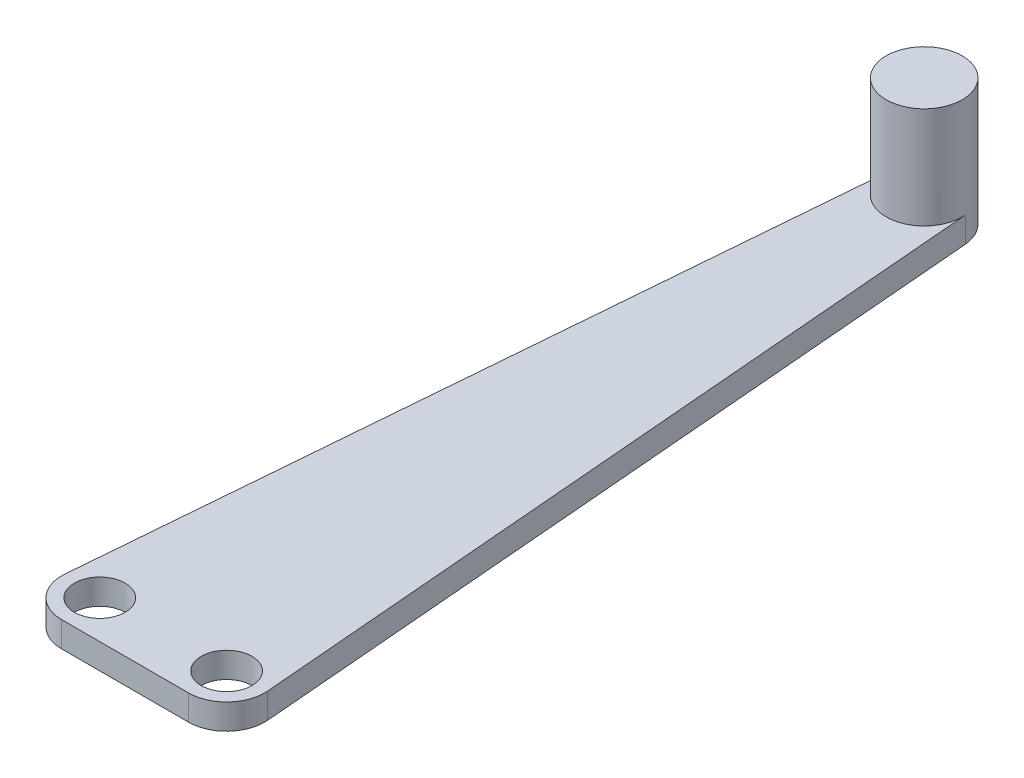
ISO-10303-21;
HEADER;
FILE_DESCRIPTION(('STEP AP214'),'2;1');
FILE_NAME('part.step','',(''),(''),'','','');
FILE_SCHEMA(('AUTOMOTIVE_DESIGN { 1 0 10303 214 1 1 1 1 }'));
ENDSEC;
DATA;
#1=APPLICATION_CONTEXT('core data for automotive mechanical design processes');
#2=APPLICATION_PROTOCOL_DEFINITION('international standard','automotive_design',2000,#1);
#3=PRODUCT_CONTEXT('',#1,'mechanical');
#4=PRODUCT('Part','Part','',(#3));
#5=PRODUCT_RELATED_PRODUCT_CATEGORY('part','',(#4));
#6=PRODUCT_DEFINITION_FORMATION('','',#4);
#7=PRODUCT_DEFINITION_CONTEXT('part definition',#1,'design');
#8=PRODUCT_DEFINITION('design','',#6,#7);
#9=PRODUCT_DEFINITION_SHAPE('','',#8);
#10=(LENGTH_UNIT() NAMED_UNIT(*) SI_UNIT(.MILLI.,.METRE.));
#11=(NAMED_UNIT(*) PLANE_ANGLE_UNIT() SI_UNIT($,.RADIAN.));
#12=(NAMED_UNIT(*) SI_UNIT($,.STERADIAN.) SOLID_ANGLE_UNIT());
#13=UNCERTAINTY_MEASURE_WITH_UNIT(LENGTH_MEASURE(1.E-05),#10,'distance_accuracy_value','');
#14=(GEOMETRIC_REPRESENTATION_CONTEXT(3) GLOBAL_UNCERTAINTY_ASSIGNED_CONTEXT((#13)) GLOBAL_UNIT_ASSIGNED_CONTEXT((#10,
#11,#12)) REPRESENTATION_CONTEXT('',''));
#15=CARTESIAN_POINT('',(0.,0.,0.));
#16=DIRECTION('',(0.,0.,1.));
#17=DIRECTION('',(1.,0.,0.));
#18=AXIS2_PLACEMENT_3D('',#15,#16,#17);
#19=CARTESIAN_POINT('',(-39.7757725805698,10.,-3.31464771504748));
#20=DIRECTION('',(-0.99654575824488,0.,-0.08304547985374));
#21=DIRECTION('',(-0.08304547985374,0.,0.99654575824488));
#22=AXIS2_PLACEMENT_3D('',#19,#20,#21);
#23=PLANE('',#22);
#24=DIRECTION('',(0.08304547985374,0.,-0.99654575824488));
#25=VECTOR('',#24,1.);
#26=CARTESIAN_POINT('',(-39.7757725805698,0.,-3.31464771504748));
#27=LINE('',#26,#25);
#28=CARTESIAN_POINT('',(-39.9481863736732,0.,-1.2456821978061));
#29=VERTEX_POINT('',#28);
#30=CARTESIAN_POINT('',(-14.9481863736732,0.,-301.245682197806));
#31=VERTEX_POINT('',#30);
#32=EDGE_CURVE('E124',#29,#31,#27,.T.);
#33=ORIENTED_EDGE('',*,*,#32,.F.);
#34=DIRECTION('',(0.,-1.,0.));
#35=VECTOR('',#34,1.);
#36=CARTESIAN_POINT('',(-39.9481863736732,10.,-1.2456821978061));
#37=LINE('',#36,#35);
#38=CARTESIAN_POINT('',(-39.9481863736732,10.,-1.2456821978061));
#39=VERTEX_POINT('',#38);
#40=EDGE_CURVE('E38',#39,#29,#37,.T.);
#41=ORIENTED_EDGE('',*,*,#40,.F.);
#42=DIRECTION('',(0.08304547985374,0.,-0.99654575824488));
#43=VECTOR('',#42,1.);
#44=CARTESIAN_POINT('',(-39.7757725805698,10.,-3.31464771504748));
#45=LINE('',#44,#43);
#46=CARTESIAN_POINT('',(-14.9481863736732,10.,-301.245682197806));
#47=VERTEX_POINT('',#46);
#48=EDGE_CURVE('E153',#39,#47,#45,.T.);
#49=ORIENTED_EDGE('',*,*,#48,.T.);
#50=DIRECTION('',(0.,-1.,0.));
#51=VECTOR('',#50,1.);
#52=CARTESIAN_POINT('',(-14.9481863736732,10.,-301.245682197806));
#53=LINE('',#52,#51);
#54=EDGE_CURVE('E81',#47,#31,#53,.T.);
#55=ORIENTED_EDGE('',*,*,#54,.T.);
#56=EDGE_LOOP('',(#33,#41,#49,#55));
#57=FACE_BOUND('',#56,.T.);
#58=ADVANCED_FACE('F35',(#57),#23,.T.);
#59=CARTESIAN_POINT('',(-25.,10.,0.));
#60=DIRECTION('',(0.,-1.,0.));
#61=DIRECTION('',(0.,0.,-1.));
#62=AXIS2_PLACEMENT_3D('',#59,#60,#61);
#63=CYLINDRICAL_SURFACE('',#62,15.);
#64=CARTESIAN_POINT('',(-25.,0.,0.));
#65=DIRECTION('',(0.,1.,0.));
#66=DIRECTION('',(0.,0.,1.));
#67=AXIS2_PLACEMENT_3D('',#64,#65,#66);
#68=CIRCLE('',#67,15.);
#69=CARTESIAN_POINT('',(-25.,0.,15.));
#70=VERTEX_POINT('',#69);
#71=EDGE_CURVE('E133',#70,#29,#68,.F.);
#72=ORIENTED_EDGE('',*,*,#71,.F.);
#73=DIRECTION('',(0.,-1.,0.));
#74=VECTOR('',#73,1.);
#75=CARTESIAN_POINT('',(-25.,10.,15.));
#76=LINE('',#75,#74);
#77=CARTESIAN_POINT('',(-25.,10.,15.));
#78=VERTEX_POINT('',#77);
#79=EDGE_CURVE('E110',#78,#70,#76,.T.);
#80=ORIENTED_EDGE('',*,*,#79,.F.);
#81=CARTESIAN_POINT('',(-25.,10.,0.));
#82=DIRECTION('',(0.,1.,0.));
#83=DIRECTION('',(0.,0.,1.));
#84=AXIS2_PLACEMENT_3D('',#81,#82,#83);
#85=CIRCLE('',#84,15.);
#86=EDGE_CURVE('E99',#78,#39,#85,.F.);
#87=ORIENTED_EDGE('',*,*,#86,.T.);
#88=ORIENTED_EDGE('',*,*,#40,.T.);
#89=EDGE_LOOP('',(#72,#80,#87,#88));
#90=FACE_BOUND('',#89,.T.);
#91=ADVANCED_FACE('F158',(#90),#63,.T.);
#92=CARTESIAN_POINT('',(0.,10.,15.));
#93=DIRECTION('',(0.,0.,-1.));
#94=DIRECTION('',(-1.,0.,0.));
#95=AXIS2_PLACEMENT_3D('',#92,#93,#94);
#96=PLANE('',#95);
#97=DIRECTION('',(1.,0.,0.));
#98=VECTOR('',#97,1.);
#99=CARTESIAN_POINT('',(0.,0.,15.));
#100=LINE('',#99,#98);
#101=CARTESIAN_POINT('',(25.,0.,15.));
#102=VERTEX_POINT('',#101);
#103=EDGE_CURVE('E106',#70,#102,#100,.T.);
#104=ORIENTED_EDGE('',*,*,#103,.T.);
#105=DIRECTION('',(0.,-1.,0.));
#106=VECTOR('',#105,1.);
#107=CARTESIAN_POINT('',(25.,10.,15.));
#108=LINE('',#107,#106);
#109=CARTESIAN_POINT('',(25.,10.,15.));
#110=VERTEX_POINT('',#109);
#111=EDGE_CURVE('E103',#110,#102,#108,.T.);
#112=ORIENTED_EDGE('',*,*,#111,.F.);
#113=DIRECTION('',(1.,0.,0.));
#114=VECTOR('',#113,1.);
#115=CARTESIAN_POINT('',(0.,10.,15.));
#116=LINE('',#115,#114);
#117=EDGE_CURVE('E91',#78,#110,#116,.T.);
#118=ORIENTED_EDGE('',*,*,#117,.F.);
#119=ORIENTED_EDGE('',*,*,#79,.T.);
#120=EDGE_LOOP('',(#104,#112,#118,#119));
#121=FACE_BOUND('',#120,.T.);
#122=ADVANCED_FACE('F104',(#121),#96,.F.);
#123=CARTESIAN_POINT('',(25.,10.,0.));
#124=DIRECTION('',(0.,-1.,0.));
#125=DIRECTION('',(0.,0.,-1.));
#126=AXIS2_PLACEMENT_3D('',#123,#124,#125);
#127=CYLINDRICAL_SURFACE('',#126,15.);
#128=CARTESIAN_POINT('',(25.,0.,0.));
#129=DIRECTION('',(0.,1.,0.));
#130=DIRECTION('',(0.,0.,1.));
#131=AXIS2_PLACEMENT_3D('',#128,#129,#130);
#132=CIRCLE('',#131,15.);
#133=CARTESIAN_POINT('',(39.9481863736732,0.,-1.24568219780611));
#134=VERTEX_POINT('',#133);
#135=EDGE_CURVE('E137',#102,#134,#132,.T.);
#136=ORIENTED_EDGE('',*,*,#135,.T.);
#137=DIRECTION('',(0.,-1.,0.));
#138=VECTOR('',#137,1.);
#139=CARTESIAN_POINT('',(39.9481863736732,10.,-1.24568219780611));
#140=LINE('',#139,#138);
#141=CARTESIAN_POINT('',(39.9481863736732,10.,-1.24568219780611));
#142=VERTEX_POINT('',#141);
#143=EDGE_CURVE('E111',#142,#134,#140,.T.);
#144=ORIENTED_EDGE('',*,*,#143,.F.);
#145=CARTESIAN_POINT('',(25.,10.,0.));
#146=DIRECTION('',(0.,1.,0.));
#147=DIRECTION('',(0.,0.,1.));
#148=AXIS2_PLACEMENT_3D('',#145,#146,#147);
#149=CIRCLE('',#148,15.);
#150=EDGE_CURVE('E96',#110,#142,#149,.T.);
#151=ORIENTED_EDGE('',*,*,#150,.F.);
#152=ORIENTED_EDGE('',*,*,#111,.T.);
#153=EDGE_LOOP('',(#136,#144,#151,#152));
#154=FACE_BOUND('',#153,.T.);
#155=ADVANCED_FACE('F113',(#154),#127,.T.);
#156=CARTESIAN_POINT('',(39.7757725805698,10.,-3.31464771504748));
#157=DIRECTION('',(0.99654575824488,0.,-0.08304547985374));
#158=DIRECTION('',(-0.08304547985374,0.,-0.99654575824488));
#159=AXIS2_PLACEMENT_3D('',#156,#157,#158);
#160=PLANE('',#159);
#161=DIRECTION('',(0.08304547985374,0.,0.99654575824488));
#162=VECTOR('',#161,1.);
#163=CARTESIAN_POINT('',(39.7757725805698,0.,-3.31464771504748));
#164=LINE('',#163,#162);
#165=CARTESIAN_POINT('',(14.9481863736732,0.,-301.245682197806));
#166=VERTEX_POINT('',#165);
#167=EDGE_CURVE('E139',#166,#134,#164,.T.);
#168=ORIENTED_EDGE('',*,*,#167,.F.);
#169=DIRECTION('',(0.,-1.,0.));
#170=VECTOR('',#169,1.);
#171=CARTESIAN_POINT('',(14.9481863736732,10.,-301.245682197806));
#172=LINE('',#171,#170);
#173=CARTESIAN_POINT('',(14.9481863736732,10.,-301.245682197806));
#174=VERTEX_POINT('',#173);
#175=EDGE_CURVE('E74',#174,#166,#172,.T.);
#176=ORIENTED_EDGE('',*,*,#175,.F.);
#177=DIRECTION('',(0.08304547985374,0.,0.99654575824488));
#178=VECTOR('',#177,1.);
#179=CARTESIAN_POINT('',(39.7757725805698,10.,-3.31464771504748));
#180=LINE('',#179,#178);
#181=EDGE_CURVE('E115',#174,#142,#180,.T.);
#182=ORIENTED_EDGE('',*,*,#181,.T.);
#183=ORIENTED_EDGE('',*,*,#143,.T.);
#184=EDGE_LOOP('',(#168,#176,#182,#183));
#185=FACE_BOUND('',#184,.T.);
#186=ADVANCED_FACE('F164',(#185),#160,.T.);
#187=CARTESIAN_POINT('',(25.,10.,0.));
#188=DIRECTION('',(0.,-1.,0.));
#189=DIRECTION('',(0.,0.,-1.));
#190=AXIS2_PLACEMENT_3D('',#187,#188,#189);
#191=CYLINDRICAL_SURFACE('',#190,10.);
#192=CARTESIAN_POINT('',(25.,10.,0.));
#193=DIRECTION('',(0.,1.,0.));
#194=DIRECTION('',(0.,0.,1.));
#195=AXIS2_PLACEMENT_3D('',#192,#193,#194);
#196=CIRCLE('',#195,10.);
#197=CARTESIAN_POINT('',(25.,10.,9.99999999999999));
#198=VERTEX_POINT('',#197);
#199=EDGE_CURVE('E117',#198,#198,#196,.T.);
#200=ORIENTED_EDGE('',*,*,#199,.T.);
#201=EDGE_LOOP('',(#200));
#202=FACE_BOUND('',#201,.T.);
#203=CARTESIAN_POINT('',(25.,0.,0.));
#204=DIRECTION('',(0.,1.,0.));
#205=DIRECTION('',(0.,0.,1.));
#206=AXIS2_PLACEMENT_3D('',#203,#204,#205);
#207=CIRCLE('',#206,10.);
#208=CARTESIAN_POINT('',(25.,0.,9.99999999999999));
#209=VERTEX_POINT('',#208);
#210=EDGE_CURVE('E147',#209,#209,#207,.T.);
#211=ORIENTED_EDGE('',*,*,#210,.F.);
#212=EDGE_LOOP('',(#211));
#213=FACE_BOUND('',#212,.T.);
#214=ADVANCED_FACE('F183',(#202,#213),#191,.F.);
#215=CARTESIAN_POINT('',(0.,10.,-300.));
#216=DIRECTION('',(0.,-1.,0.));
#217=DIRECTION('',(0.,0.,-1.));
#218=AXIS2_PLACEMENT_3D('',#215,#216,#217);
#219=CYLINDRICAL_SURFACE('',#218,10.);
#220=CARTESIAN_POINT('',(0.,10.,-300.));
#221=DIRECTION('',(0.,1.,0.));
#222=DIRECTION('',(0.,0.,1.));
#223=AXIS2_PLACEMENT_3D('',#220,#221,#222);
#224=CIRCLE('',#223,10.);
#225=CARTESIAN_POINT('',(0.,10.,-290.));
#226=VERTEX_POINT('',#225);
#227=EDGE_CURVE('E121',#226,#226,#224,.T.);
#228=ORIENTED_EDGE('',*,*,#227,.T.);
#229=EDGE_LOOP('',(#228));
#230=FACE_BOUND('',#229,.T.);
#231=CARTESIAN_POINT('',(0.,0.,-300.));
#232=DIRECTION('',(0.,1.,0.));
#233=DIRECTION('',(0.,0.,1.));
#234=AXIS2_PLACEMENT_3D('',#231,#232,#233);
#235=CIRCLE('',#234,10.);
#236=CARTESIAN_POINT('',(0.,0.,-290.));
#237=VERTEX_POINT('',#236);
#238=EDGE_CURVE('E144',#237,#237,#235,.T.);
#239=ORIENTED_EDGE('',*,*,#238,.F.);
#240=EDGE_LOOP('',(#239));
#241=FACE_BOUND('',#240,.T.);
#242=ADVANCED_FACE('F175',(#230,#241),#219,.F.);
#243=CARTESIAN_POINT('',(0.,10.,-300.));
#244=DIRECTION('',(0.,-1.,0.));
#245=DIRECTION('',(0.,0.,-1.));
#246=AXIS2_PLACEMENT_3D('',#243,#244,#245);
#247=CYLINDRICAL_SURFACE('',#246,15.);
#248=CARTESIAN_POINT('',(0.,0.,-300.));
#249=DIRECTION('',(0.,1.,0.));
#250=DIRECTION('',(0.,0.,1.));
#251=AXIS2_PLACEMENT_3D('',#248,#249,#250);
#252=CIRCLE('',#251,15.);
#253=EDGE_CURVE('E142',#166,#31,#252,.T.);
#254=ORIENTED_EDGE('',*,*,#253,.T.);
#255=ORIENTED_EDGE('',*,*,#54,.F.);
#256=CARTESIAN_POINT('',(0.,10.,-300.));
#257=DIRECTION('',(0.,1.,0.));
#258=DIRECTION('',(0.,0.,1.));
#259=AXIS2_PLACEMENT_3D('',#256,#257,#258);
#260=CIRCLE('',#259,15.);
#261=EDGE_CURVE('E11',#47,#174,#260,.T.);
#262=ORIENTED_EDGE('',*,*,#261,.T.);
#263=ORIENTED_EDGE('',*,*,#175,.T.);
#264=EDGE_LOOP('',(#254,#255,#262,#263));
#265=FACE_BOUND('',#264,.T.);
#266=CARTESIAN_POINT('',(0.,50.,-300.));
#267=DIRECTION('',(0.,1.,0.));
#268=DIRECTION('',(0.,0.,1.));
#269=AXIS2_PLACEMENT_3D('',#266,#267,#268);
#270=CIRCLE('',#269,15.);
#271=CARTESIAN_POINT('',(0.,50.,-285.));
#272=VERTEX_POINT('',#271);
#273=EDGE_CURVE('E125',#272,#272,#270,.T.);
#274=ORIENTED_EDGE('',*,*,#273,.F.);
#275=EDGE_LOOP('',(#274));
#276=FACE_BOUND('',#275,.T.);
#277=ADVANCED_FACE('F165',(#265,#276),#247,.T.);
#278=CARTESIAN_POINT('',(-25.,10.,0.));
#279=DIRECTION('',(0.,-1.,0.));
#280=DIRECTION('',(0.,0.,-1.));
#281=AXIS2_PLACEMENT_3D('',#278,#279,#280);
#282=CYLINDRICAL_SURFACE('',#281,10.);
#283=CARTESIAN_POINT('',(-25.,10.,0.));
#284=DIRECTION('',(0.,1.,0.));
#285=DIRECTION('',(0.,0.,1.));
#286=AXIS2_PLACEMENT_3D('',#283,#284,#285);
#287=CIRCLE('',#286,10.);
#288=CARTESIAN_POINT('',(-25.,10.,10.));
#289=VERTEX_POINT('',#288);
#290=EDGE_CURVE('E128',#289,#289,#287,.F.);
#291=ORIENTED_EDGE('',*,*,#290,.F.);
#292=EDGE_LOOP('',(#291));
#293=FACE_BOUND('',#292,.T.);
#294=CARTESIAN_POINT('',(-25.,0.,0.));
#295=DIRECTION('',(0.,1.,0.));
#296=DIRECTION('',(0.,0.,1.));
#297=AXIS2_PLACEMENT_3D('',#294,#295,#296);
#298=CIRCLE('',#297,10.);
#299=CARTESIAN_POINT('',(-25.,0.,10.));
#300=VERTEX_POINT('',#299);
#301=EDGE_CURVE('E150',#300,#300,#298,.F.);
#302=ORIENTED_EDGE('',*,*,#301,.T.);
#303=EDGE_LOOP('',(#302));
#304=FACE_BOUND('',#303,.T.);
#305=ADVANCED_FACE('F174',(#293,#304),#282,.F.);
#306=CARTESIAN_POINT('',(0.,10.,0.));
#307=DIRECTION('',(0.,1.,0.));
#308=DIRECTION('',(0.,0.,1.));
#309=AXIS2_PLACEMENT_3D('',#306,#307,#308);
#310=PLANE('',#309);
#311=ORIENTED_EDGE('',*,*,#261,.F.);
#312=ORIENTED_EDGE('',*,*,#48,.F.);
#313=ORIENTED_EDGE('',*,*,#86,.F.);
#314=ORIENTED_EDGE('',*,*,#117,.T.);
#315=ORIENTED_EDGE('',*,*,#150,.T.);
#316=ORIENTED_EDGE('',*,*,#181,.F.);
#317=EDGE_LOOP('',(#311,#312,#313,#314,#315,#316));
#318=FACE_BOUND('',#317,.T.);
#319=ORIENTED_EDGE('',*,*,#199,.F.);
#320=EDGE_LOOP('',(#319));
#321=FACE_BOUND('',#320,.T.);
#322=ORIENTED_EDGE('',*,*,#290,.T.);
#323=EDGE_LOOP('',(#322));
#324=FACE_BOUND('',#323,.T.);
#325=ADVANCED_FACE('F93',(#318,#321,#324),#310,.T.);
#326=CARTESIAN_POINT('',(0.,0.,0.));
#327=DIRECTION('',(0.,1.,0.));
#328=DIRECTION('',(0.,0.,1.));
#329=AXIS2_PLACEMENT_3D('',#326,#327,#328);
#330=PLANE('',#329);
#331=ORIENTED_EDGE('',*,*,#32,.T.);
#332=ORIENTED_EDGE('',*,*,#253,.F.);
#333=ORIENTED_EDGE('',*,*,#167,.T.);
#334=ORIENTED_EDGE('',*,*,#135,.F.);
#335=ORIENTED_EDGE('',*,*,#103,.F.);
#336=ORIENTED_EDGE('',*,*,#71,.T.);
#337=EDGE_LOOP('',(#331,#332,#333,#334,#335,#336));
#338=FACE_BOUND('',#337,.T.);
#339=ORIENTED_EDGE('',*,*,#238,.T.);
#340=EDGE_LOOP('',(#339));
#341=FACE_BOUND('',#340,.T.);
#342=ORIENTED_EDGE('',*,*,#210,.T.);
#343=EDGE_LOOP('',(#342));
#344=FACE_BOUND('',#343,.T.);
#345=ORIENTED_EDGE('',*,*,#301,.F.);
#346=EDGE_LOOP('',(#345));
#347=FACE_BOUND('',#346,.T.);
#348=ADVANCED_FACE('F160',(#338,#341,#344,#347),#330,.F.);
#349=CARTESIAN_POINT('',(0.,50.,-300.));
#350=DIRECTION('',(0.,1.,0.));
#351=DIRECTION('',(0.,0.,1.));
#352=AXIS2_PLACEMENT_3D('',#349,#350,#351);
#353=PLANE('',#352);
#354=ORIENTED_EDGE('',*,*,#273,.T.);
#355=EDGE_LOOP('',(#354));
#356=FACE_BOUND('',#355,.T.);
#357=ADVANCED_FACE('F172',(#356),#353,.T.);
#358=CARTESIAN_POINT('',(0.,10.,-300.));
#359=DIRECTION('',(0.,1.,0.));
#360=DIRECTION('',(0.,0.,1.));
#361=AXIS2_PLACEMENT_3D('',#358,#359,#360);
#362=PLANE('',#361);
#363=ORIENTED_EDGE('',*,*,#227,.F.);
#364=EDGE_LOOP('',(#363));
#365=FACE_BOUND('',#364,.T.);
#366=ADVANCED_FACE('F211',(#365),#362,.F.);
#367=CLOSED_SHELL('',(#58,#91,#122,#155,#186,#214,#242,#277,#305,#325,#348,#357,#366));
#368=MANIFOLD_SOLID_BREP('B2',#367);
#369=ADVANCED_BREP_SHAPE_REPRESENTATION('',(#18,#368),#14);
#370=SHAPE_DEFINITION_REPRESENTATION(#9,#369);
ENDSEC;
END-ISO-10303-21;
